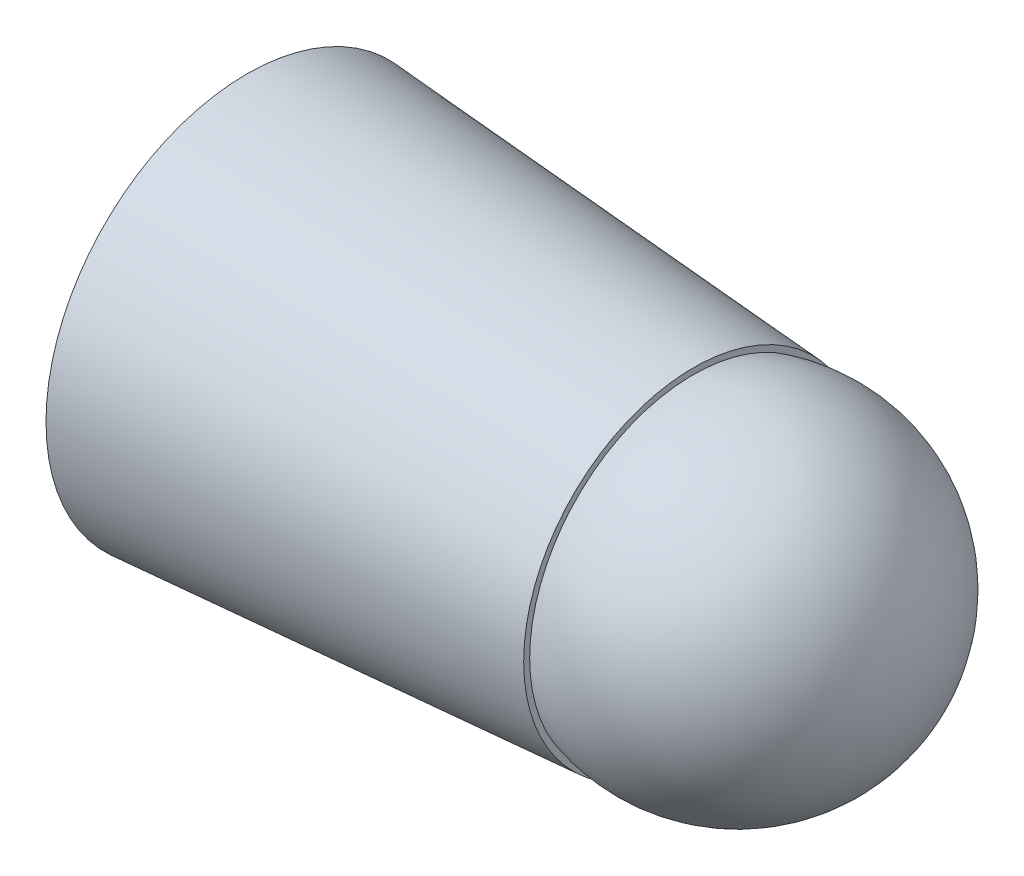
ISO-10303-21;
HEADER;
FILE_DESCRIPTION(('STEP AP214'),'2;1');
FILE_NAME('part.step','',(''),(''),'','','');
FILE_SCHEMA(('AUTOMOTIVE_DESIGN { 1 0 10303 214 1 1 1 1 }'));
ENDSEC;
DATA;
#1=APPLICATION_CONTEXT('core data for automotive mechanical design processes');
#2=APPLICATION_PROTOCOL_DEFINITION('international standard','automotive_design',2000,#1);
#3=PRODUCT_CONTEXT('',#1,'mechanical');
#4=PRODUCT('Part','Part','',(#3));
#5=PRODUCT_RELATED_PRODUCT_CATEGORY('part','',(#4));
#6=PRODUCT_DEFINITION_FORMATION('','',#4);
#7=PRODUCT_DEFINITION_CONTEXT('part definition',#1,'design');
#8=PRODUCT_DEFINITION('design','',#6,#7);
#9=PRODUCT_DEFINITION_SHAPE('','',#8);
#10=(LENGTH_UNIT() NAMED_UNIT(*) SI_UNIT(.MILLI.,.METRE.));
#11=(NAMED_UNIT(*) PLANE_ANGLE_UNIT() SI_UNIT($,.RADIAN.));
#12=(NAMED_UNIT(*) SI_UNIT($,.STERADIAN.) SOLID_ANGLE_UNIT());
#13=UNCERTAINTY_MEASURE_WITH_UNIT(LENGTH_MEASURE(1.E-05),#10,'distance_accuracy_value','');
#14=(GEOMETRIC_REPRESENTATION_CONTEXT(3) GLOBAL_UNCERTAINTY_ASSIGNED_CONTEXT((#13)) GLOBAL_UNIT_ASSIGNED_CONTEXT((#10,
#11,#12)) REPRESENTATION_CONTEXT('',''));
#15=CARTESIAN_POINT('',(0.,0.,0.));
#16=DIRECTION('',(0.,0.,1.));
#17=DIRECTION('',(1.,0.,0.));
#18=AXIS2_PLACEMENT_3D('',#15,#16,#17);
#19=CARTESIAN_POINT('',(10.,0.,0.));
#20=DIRECTION('',(1.,0.,0.));
#21=DIRECTION('',(0.,0.,1.));
#22=AXIS2_PLACEMENT_3D('',#19,#20,#21);
#23=PLANE('',#22);
#24=CARTESIAN_POINT('',(10.,0.,0.));
#25=DIRECTION('',(-1.,0.,0.));
#26=DIRECTION('',(0.,0.,1.));
#27=AXIS2_PLACEMENT_3D('',#24,#25,#26);
#28=CIRCLE('',#27,3.80073188056489);
#29=CARTESIAN_POINT('',(10.,0.,3.80073188056489));
#30=VERTEX_POINT('',#29);
#31=EDGE_CURVE('E10',#30,#30,#28,.T.);
#32=ORIENTED_EDGE('',*,*,#31,.F.);
#33=EDGE_LOOP('',(#32));
#34=FACE_BOUND('',#33,.T.);
#35=CARTESIAN_POINT('',(10.,0.,0.));
#36=DIRECTION('',(-1.,0.,0.));
#37=DIRECTION('',(0.,0.,1.));
#38=AXIS2_PLACEMENT_3D('',#35,#36,#37);
#39=CIRCLE('',#38,3.66681917033583);
#40=CARTESIAN_POINT('',(10.,0.,3.66681917033583));
#41=VERTEX_POINT('',#40);
#42=EDGE_CURVE('E39',#41,#41,#39,.F.);
#43=ORIENTED_EDGE('',*,*,#42,.F.);
#44=EDGE_LOOP('',(#43));
#45=FACE_BOUND('',#44,.T.);
#46=ADVANCED_FACE('F35',(#34,#45),#23,.T.);
#47=CARTESIAN_POINT('',(0.,0.,0.));
#48=DIRECTION('',(-1.,0.,0.));
#49=DIRECTION('',(0.,0.,1.));
#50=AXIS2_PLACEMENT_3D('',#47,#48,#49);
#51=CONICAL_SURFACE('',#50,4.5,0.0698131700797732);
#52=ORIENTED_EDGE('',*,*,#31,.T.);
#53=EDGE_LOOP('',(#52));
#54=FACE_BOUND('',#53,.T.);
#55=CARTESIAN_POINT('',(0.,0.,0.));
#56=DIRECTION('',(-1.,0.,0.));
#57=DIRECTION('',(0.,0.,1.));
#58=AXIS2_PLACEMENT_3D('',#55,#56,#57);
#59=CIRCLE('',#58,4.5);
#60=CARTESIAN_POINT('',(0.,0.,4.5));
#61=VERTEX_POINT('',#60);
#62=EDGE_CURVE('E43',#61,#61,#59,.T.);
#63=ORIENTED_EDGE('',*,*,#62,.F.);
#64=EDGE_LOOP('',(#63));
#65=FACE_BOUND('',#64,.T.);
#66=ADVANCED_FACE('F37',(#54,#65),#51,.T.);
#67=CARTESIAN_POINT('',(0.,0.,0.));
#68=DIRECTION('',(1.,0.,0.));
#69=DIRECTION('',(0.,0.,1.));
#70=AXIS2_PLACEMENT_3D('',#67,#68,#69);
#71=PLANE('',#70);
#72=ORIENTED_EDGE('',*,*,#62,.T.);
#73=EDGE_LOOP('',(#72));
#74=FACE_BOUND('',#73,.T.);
#75=ADVANCED_FACE('F61',(#74),#71,.F.);
#76=CARTESIAN_POINT('',(11.,0.,0.));
#77=DIRECTION('',(0.,1.,0.));
#78=DIRECTION('',(0.,0.,1.));
#79=AXIS2_PLACEMENT_3D('',#76,#77,#78);
#80=SPHERICAL_SURFACE('',#79,3.80073188056489);
#81=CARTESIAN_POINT('',(11.,0.,0.));
#82=DIRECTION('',(-1.,0.,0.));
#83=DIRECTION('',(0.,0.,1.));
#84=AXIS2_PLACEMENT_3D('',#81,#82,#83);
#85=SPHERICAL_SURFACE('',#84,3.80073188056489);
#86=ORIENTED_EDGE('',*,*,#42,.T.);
#87=EDGE_LOOP('',(#86));
#88=FACE_BOUND('',#87,.T.);
#89=ADVANCED_FACE('F53',(#88),#85,.T.);
#90=CLOSED_SHELL('',(#46,#66,#75,#89));
#91=MANIFOLD_SOLID_BREP('B2',#90);
#92=ADVANCED_BREP_SHAPE_REPRESENTATION('',(#18,#91),#14);
#93=SHAPE_DEFINITION_REPRESENTATION(#9,#92);
ENDSEC;
END-ISO-10303-21;
